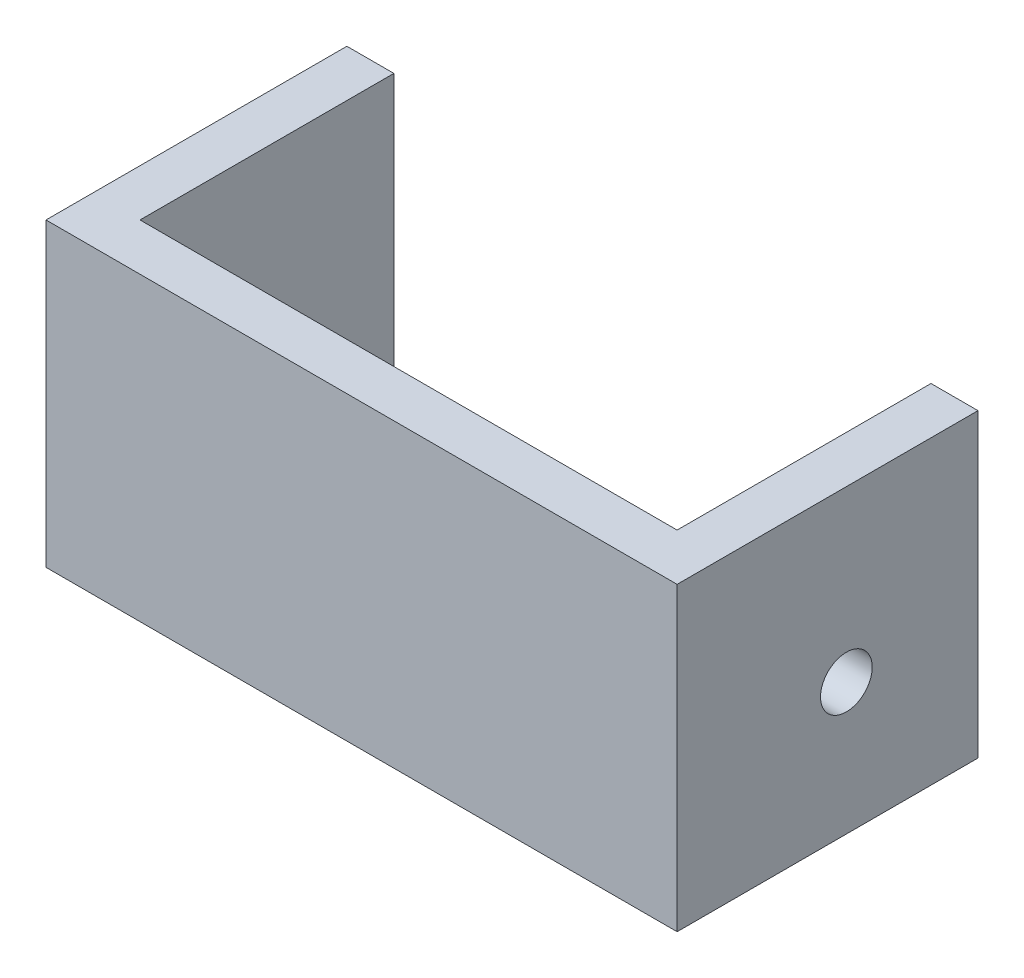
ISO-10303-21;
HEADER;
FILE_DESCRIPTION(('STEP AP214'),'2;1');
FILE_NAME('part.step','',(''),(''),'','','');
FILE_SCHEMA(('AUTOMOTIVE_DESIGN { 1 0 10303 214 1 1 1 1 }'));
ENDSEC;
DATA;
#1=APPLICATION_CONTEXT('core data for automotive mechanical design processes');
#2=APPLICATION_PROTOCOL_DEFINITION('international standard','automotive_design',2000,#1);
#3=PRODUCT_CONTEXT('',#1,'mechanical');
#4=PRODUCT('Part','Part','',(#3));
#5=PRODUCT_RELATED_PRODUCT_CATEGORY('part','',(#4));
#6=PRODUCT_DEFINITION_FORMATION('','',#4);
#7=PRODUCT_DEFINITION_CONTEXT('part definition',#1,'design');
#8=PRODUCT_DEFINITION('design','',#6,#7);
#9=PRODUCT_DEFINITION_SHAPE('','',#8);
#10=(LENGTH_UNIT() NAMED_UNIT(*) SI_UNIT(.MILLI.,.METRE.));
#11=(NAMED_UNIT(*) PLANE_ANGLE_UNIT() SI_UNIT($,.RADIAN.));
#12=(NAMED_UNIT(*) SI_UNIT($,.STERADIAN.) SOLID_ANGLE_UNIT());
#13=UNCERTAINTY_MEASURE_WITH_UNIT(LENGTH_MEASURE(1.E-05),#10,'distance_accuracy_value','');
#14=(GEOMETRIC_REPRESENTATION_CONTEXT(3) GLOBAL_UNCERTAINTY_ASSIGNED_CONTEXT((#13)) GLOBAL_UNIT_ASSIGNED_CONTEXT((#10,
#11,#12)) REPRESENTATION_CONTEXT('',''));
#15=CARTESIAN_POINT('',(0.,0.,0.));
#16=DIRECTION('',(0.,0.,1.));
#17=DIRECTION('',(1.,0.,0.));
#18=AXIS2_PLACEMENT_3D('',#15,#16,#17);
#19=CARTESIAN_POINT('',(-33.5625,16.,32.));
#20=DIRECTION('',(1.,0.,0.));
#21=DIRECTION('',(0.,0.,-1.));
#22=AXIS2_PLACEMENT_3D('',#19,#20,#21);
#23=PLANE('',#22);
#24=CARTESIAN_POINT('',(-33.5625,-2.,14.));
#25=DIRECTION('',(1.,0.,0.));
#26=DIRECTION('',(0.,0.,-1.));
#27=AXIS2_PLACEMENT_3D('',#24,#25,#26);
#28=CIRCLE('',#27,2.75);
#29=CARTESIAN_POINT('',(-33.5625,-2.,11.25));
#30=VERTEX_POINT('',#29);
#31=EDGE_CURVE('E230',#30,#30,#28,.T.);
#32=ORIENTED_EDGE('',*,*,#31,.T.);
#33=EDGE_LOOP('',(#32));
#34=FACE_BOUND('',#33,.T.);
#35=DIRECTION('',(0.,-1.,0.));
#36=VECTOR('',#35,1.);
#37=CARTESIAN_POINT('',(-33.5625,16.,0.));
#38=LINE('',#37,#36);
#39=CARTESIAN_POINT('',(-33.5625,16.,0.));
#40=VERTEX_POINT('',#39);
#41=CARTESIAN_POINT('',(-33.5625,-16.,0.));
#42=VERTEX_POINT('',#41);
#43=EDGE_CURVE('E161',#40,#42,#38,.T.);
#44=ORIENTED_EDGE('',*,*,#43,.T.);
#45=DIRECTION('',(0.,0.,-1.));
#46=VECTOR('',#45,1.);
#47=CARTESIAN_POINT('',(-33.5625,-16.,32.));
#48=LINE('',#47,#46);
#49=CARTESIAN_POINT('',(-33.5625,-16.,32.));
#50=VERTEX_POINT('',#49);
#51=EDGE_CURVE('E11',#50,#42,#48,.T.);
#52=ORIENTED_EDGE('',*,*,#51,.F.);
#53=DIRECTION('',(0.,-1.,0.));
#54=VECTOR('',#53,1.);
#55=CARTESIAN_POINT('',(-33.5625,16.,32.));
#56=LINE('',#55,#54);
#57=CARTESIAN_POINT('',(-33.5625,16.,32.));
#58=VERTEX_POINT('',#57);
#59=EDGE_CURVE('E167',#58,#50,#56,.T.);
#60=ORIENTED_EDGE('',*,*,#59,.F.);
#61=DIRECTION('',(0.,0.,-1.));
#62=VECTOR('',#61,1.);
#63=CARTESIAN_POINT('',(-33.5625,16.,32.));
#64=LINE('',#63,#62);
#65=EDGE_CURVE('E178',#58,#40,#64,.T.);
#66=ORIENTED_EDGE('',*,*,#65,.T.);
#67=EDGE_LOOP('',(#44,#52,#60,#66));
#68=FACE_BOUND('',#67,.T.);
#69=ADVANCED_FACE('F43',(#34,#68),#23,.F.);
#70=CARTESIAN_POINT('',(33.5625,-16.,32.));
#71=DIRECTION('',(0.,1.,0.));
#72=DIRECTION('',(0.,0.,1.));
#73=AXIS2_PLACEMENT_3D('',#70,#71,#72);
#74=PLANE('',#73);
#75=DIRECTION('',(1.,0.,0.));
#76=VECTOR('',#75,1.);
#77=CARTESIAN_POINT('',(33.5625,-16.,0.));
#78=LINE('',#77,#76);
#79=CARTESIAN_POINT('',(33.5625,-16.,0.));
#80=VERTEX_POINT('',#79);
#81=EDGE_CURVE('E182',#42,#80,#78,.T.);
#82=ORIENTED_EDGE('',*,*,#81,.T.);
#83=DIRECTION('',(0.,0.,-1.));
#84=VECTOR('',#83,1.);
#85=CARTESIAN_POINT('',(33.5625,-16.,32.));
#86=LINE('',#85,#84);
#87=CARTESIAN_POINT('',(33.5625,-16.,32.));
#88=VERTEX_POINT('',#87);
#89=EDGE_CURVE('E52',#88,#80,#86,.T.);
#90=ORIENTED_EDGE('',*,*,#89,.F.);
#91=DIRECTION('',(1.,0.,0.));
#92=VECTOR('',#91,1.);
#93=CARTESIAN_POINT('',(33.5625,-16.,32.));
#94=LINE('',#93,#92);
#95=EDGE_CURVE('E96',#50,#88,#94,.T.);
#96=ORIENTED_EDGE('',*,*,#95,.F.);
#97=ORIENTED_EDGE('',*,*,#51,.T.);
#98=EDGE_LOOP('',(#82,#90,#96,#97));
#99=FACE_BOUND('',#98,.T.);
#100=ADVANCED_FACE('F223',(#99),#74,.F.);
#101=CARTESIAN_POINT('',(33.5625,16.,32.));
#102=DIRECTION('',(-1.,0.,0.));
#103=DIRECTION('',(0.,0.,1.));
#104=AXIS2_PLACEMENT_3D('',#101,#102,#103);
#105=PLANE('',#104);
#106=CARTESIAN_POINT('',(33.5625,-2.,14.));
#107=DIRECTION('',(1.,0.,0.));
#108=DIRECTION('',(0.,0.,-1.));
#109=AXIS2_PLACEMENT_3D('',#106,#107,#108);
#110=CIRCLE('',#109,2.75);
#111=CARTESIAN_POINT('',(33.5625,-2.,11.25));
#112=VERTEX_POINT('',#111);
#113=EDGE_CURVE('E233',#112,#112,#110,.T.);
#114=ORIENTED_EDGE('',*,*,#113,.F.);
#115=EDGE_LOOP('',(#114));
#116=FACE_BOUND('',#115,.T.);
#117=DIRECTION('',(0.,1.,0.));
#118=VECTOR('',#117,1.);
#119=CARTESIAN_POINT('',(33.5625,16.,0.));
#120=LINE('',#119,#118);
#121=CARTESIAN_POINT('',(33.5625,16.,0.));
#122=VERTEX_POINT('',#121);
#123=EDGE_CURVE('E185',#80,#122,#120,.T.);
#124=ORIENTED_EDGE('',*,*,#123,.T.);
#125=DIRECTION('',(0.,0.,-1.));
#126=VECTOR('',#125,1.);
#127=CARTESIAN_POINT('',(33.5625,16.,32.));
#128=LINE('',#127,#126);
#129=CARTESIAN_POINT('',(33.5625,16.,32.));
#130=VERTEX_POINT('',#129);
#131=EDGE_CURVE('E193',#130,#122,#128,.T.);
#132=ORIENTED_EDGE('',*,*,#131,.F.);
#133=DIRECTION('',(0.,1.,0.));
#134=VECTOR('',#133,1.);
#135=CARTESIAN_POINT('',(33.5625,16.,32.));
#136=LINE('',#135,#134);
#137=EDGE_CURVE('E173',#88,#130,#136,.T.);
#138=ORIENTED_EDGE('',*,*,#137,.F.);
#139=ORIENTED_EDGE('',*,*,#89,.T.);
#140=EDGE_LOOP('',(#124,#132,#138,#139));
#141=FACE_BOUND('',#140,.T.);
#142=ADVANCED_FACE('F202',(#116,#141),#105,.F.);
#143=CARTESIAN_POINT('',(33.5625,16.,32.));
#144=DIRECTION('',(0.,-1.,0.));
#145=DIRECTION('',(0.,0.,-1.));
#146=AXIS2_PLACEMENT_3D('',#143,#144,#145);
#147=PLANE('',#146);
#148=DIRECTION('',(-1.,0.,0.));
#149=VECTOR('',#148,1.);
#150=CARTESIAN_POINT('',(33.5625,16.,0.));
#151=LINE('',#150,#149);
#152=CARTESIAN_POINT('',(28.5625,16.,0.));
#153=VERTEX_POINT('',#152);
#154=EDGE_CURVE('E170',#122,#153,#151,.T.);
#155=ORIENTED_EDGE('',*,*,#154,.T.);
#156=DIRECTION('',(0.,0.,-1.));
#157=VECTOR('',#156,1.);
#158=CARTESIAN_POINT('',(28.5625,16.,27.));
#159=LINE('',#158,#157);
#160=CARTESIAN_POINT('',(28.5625,16.,27.));
#161=VERTEX_POINT('',#160);
#162=EDGE_CURVE('E158',#161,#153,#159,.T.);
#163=ORIENTED_EDGE('',*,*,#162,.F.);
#164=DIRECTION('',(1.,0.,0.));
#165=VECTOR('',#164,1.);
#166=CARTESIAN_POINT('',(28.5625,16.,27.));
#167=LINE('',#166,#165);
#168=CARTESIAN_POINT('',(-28.5625,16.,27.));
#169=VERTEX_POINT('',#168);
#170=EDGE_CURVE('E126',#169,#161,#167,.T.);
#171=ORIENTED_EDGE('',*,*,#170,.F.);
#172=DIRECTION('',(0.,0.,-1.));
#173=VECTOR('',#172,1.);
#174=CARTESIAN_POINT('',(-28.5625,16.,27.));
#175=LINE('',#174,#173);
#176=CARTESIAN_POINT('',(-28.5625,16.,0.));
#177=VERTEX_POINT('',#176);
#178=EDGE_CURVE('E162',#169,#177,#175,.T.);
#179=ORIENTED_EDGE('',*,*,#178,.T.);
#180=EDGE_CURVE('E89',#177,#40,#151,.T.);
#181=ORIENTED_EDGE('',*,*,#180,.T.);
#182=ORIENTED_EDGE('',*,*,#65,.F.);
#183=DIRECTION('',(-1.,0.,0.));
#184=VECTOR('',#183,1.);
#185=CARTESIAN_POINT('',(33.5625,16.,32.));
#186=LINE('',#185,#184);
#187=EDGE_CURVE('E68',#130,#58,#186,.T.);
#188=ORIENTED_EDGE('',*,*,#187,.F.);
#189=ORIENTED_EDGE('',*,*,#131,.T.);
#190=EDGE_LOOP('',(#155,#163,#171,#179,#181,#182,#188,#189));
#191=FACE_BOUND('',#190,.T.);
#192=ADVANCED_FACE('F208',(#191),#147,.F.);
#193=CARTESIAN_POINT('',(0.,0.,32.));
#194=DIRECTION('',(0.,0.,-1.));
#195=DIRECTION('',(-1.,0.,0.));
#196=AXIS2_PLACEMENT_3D('',#193,#194,#195);
#197=PLANE('',#196);
#198=ORIENTED_EDGE('',*,*,#59,.T.);
#199=ORIENTED_EDGE('',*,*,#95,.T.);
#200=ORIENTED_EDGE('',*,*,#137,.T.);
#201=ORIENTED_EDGE('',*,*,#187,.T.);
#202=EDGE_LOOP('',(#198,#199,#200,#201));
#203=FACE_BOUND('',#202,.T.);
#204=ADVANCED_FACE('F212',(#203),#197,.F.);
#205=CARTESIAN_POINT('',(0.,0.,0.));
#206=DIRECTION('',(0.,0.,-1.));
#207=DIRECTION('',(-1.,0.,0.));
#208=AXIS2_PLACEMENT_3D('',#205,#206,#207);
#209=PLANE('',#208);
#210=DIRECTION('',(0.,-1.,0.));
#211=VECTOR('',#210,1.);
#212=CARTESIAN_POINT('',(28.5625,16.,0.));
#213=LINE('',#212,#211);
#214=CARTESIAN_POINT('',(28.5625,-11.,0.));
#215=VERTEX_POINT('',#214);
#216=EDGE_CURVE('E59',#153,#215,#213,.T.);
#217=ORIENTED_EDGE('',*,*,#216,.F.);
#218=ORIENTED_EDGE('',*,*,#154,.F.);
#219=ORIENTED_EDGE('',*,*,#123,.F.);
#220=ORIENTED_EDGE('',*,*,#81,.F.);
#221=ORIENTED_EDGE('',*,*,#43,.F.);
#222=ORIENTED_EDGE('',*,*,#180,.F.);
#223=DIRECTION('',(0.,1.,0.));
#224=VECTOR('',#223,1.);
#225=CARTESIAN_POINT('',(-28.5625,16.,0.));
#226=LINE('',#225,#224);
#227=CARTESIAN_POINT('',(-28.5625,-11.,0.));
#228=VERTEX_POINT('',#227);
#229=EDGE_CURVE('E141',#228,#177,#226,.T.);
#230=ORIENTED_EDGE('',*,*,#229,.F.);
#231=DIRECTION('',(-1.,0.,0.));
#232=VECTOR('',#231,1.);
#233=CARTESIAN_POINT('',(28.5625,-11.,0.));
#234=LINE('',#233,#232);
#235=EDGE_CURVE('E144',#215,#228,#234,.T.);
#236=ORIENTED_EDGE('',*,*,#235,.F.);
#237=EDGE_LOOP('',(#217,#218,#219,#220,#221,#222,#230,#236));
#238=FACE_BOUND('',#237,.T.);
#239=ADVANCED_FACE('F206',(#238),#209,.T.);
#240=CARTESIAN_POINT('',(28.5625,16.,27.));
#241=DIRECTION('',(1.,0.,0.));
#242=DIRECTION('',(0.,1.,0.));
#243=AXIS2_PLACEMENT_3D('',#240,#241,#242);
#244=PLANE('',#243);
#245=CARTESIAN_POINT('',(28.5625,-2.,14.));
#246=DIRECTION('',(1.,0.,0.));
#247=DIRECTION('',(0.,1.,0.));
#248=AXIS2_PLACEMENT_3D('',#245,#246,#247);
#249=CIRCLE('',#248,2.75);
#250=CARTESIAN_POINT('',(28.5625,0.749999999999998,14.));
#251=VERTEX_POINT('',#250);
#252=EDGE_CURVE('E147',#251,#251,#249,.T.);
#253=ORIENTED_EDGE('',*,*,#252,.T.);
#254=EDGE_LOOP('',(#253));
#255=FACE_BOUND('',#254,.T.);
#256=ORIENTED_EDGE('',*,*,#216,.T.);
#257=DIRECTION('',(0.,0.,-1.));
#258=VECTOR('',#257,1.);
#259=CARTESIAN_POINT('',(28.5625,-11.,27.));
#260=LINE('',#259,#258);
#261=CARTESIAN_POINT('',(28.5625,-11.,27.));
#262=VERTEX_POINT('',#261);
#263=EDGE_CURVE('E115',#262,#215,#260,.T.);
#264=ORIENTED_EDGE('',*,*,#263,.F.);
#265=DIRECTION('',(0.,-1.,0.));
#266=VECTOR('',#265,1.);
#267=CARTESIAN_POINT('',(28.5625,16.,27.));
#268=LINE('',#267,#266);
#269=EDGE_CURVE('E119',#161,#262,#268,.T.);
#270=ORIENTED_EDGE('',*,*,#269,.F.);
#271=ORIENTED_EDGE('',*,*,#162,.T.);
#272=EDGE_LOOP('',(#256,#264,#270,#271));
#273=FACE_BOUND('',#272,.T.);
#274=ADVANCED_FACE('F117',(#255,#273),#244,.F.);
#275=CARTESIAN_POINT('',(-28.5625,16.,27.));
#276=DIRECTION('',(-1.,0.,0.));
#277=DIRECTION('',(0.,-1.,0.));
#278=AXIS2_PLACEMENT_3D('',#275,#276,#277);
#279=PLANE('',#278);
#280=CARTESIAN_POINT('',(-28.5625,-2.,14.));
#281=DIRECTION('',(-1.,0.,0.));
#282=DIRECTION('',(0.,-1.,0.));
#283=AXIS2_PLACEMENT_3D('',#280,#281,#282);
#284=CIRCLE('',#283,2.75);
#285=CARTESIAN_POINT('',(-28.5625,-4.75,14.));
#286=VERTEX_POINT('',#285);
#287=EDGE_CURVE('E46',#286,#286,#284,.T.);
#288=ORIENTED_EDGE('',*,*,#287,.T.);
#289=EDGE_LOOP('',(#288));
#290=FACE_BOUND('',#289,.T.);
#291=ORIENTED_EDGE('',*,*,#229,.T.);
#292=ORIENTED_EDGE('',*,*,#178,.F.);
#293=DIRECTION('',(0.,1.,0.));
#294=VECTOR('',#293,1.);
#295=CARTESIAN_POINT('',(-28.5625,16.,27.));
#296=LINE('',#295,#294);
#297=CARTESIAN_POINT('',(-28.5625,-11.,27.));
#298=VERTEX_POINT('',#297);
#299=EDGE_CURVE('E135',#298,#169,#296,.T.);
#300=ORIENTED_EDGE('',*,*,#299,.F.);
#301=DIRECTION('',(0.,0.,-1.));
#302=VECTOR('',#301,1.);
#303=CARTESIAN_POINT('',(-28.5625,-11.,27.));
#304=LINE('',#303,#302);
#305=EDGE_CURVE('E125',#298,#228,#304,.T.);
#306=ORIENTED_EDGE('',*,*,#305,.T.);
#307=EDGE_LOOP('',(#291,#292,#300,#306));
#308=FACE_BOUND('',#307,.T.);
#309=ADVANCED_FACE('F276',(#290,#308),#279,.F.);
#310=CARTESIAN_POINT('',(28.5625,-11.,27.));
#311=DIRECTION('',(0.,-1.,0.));
#312=DIRECTION('',(0.,0.,-1.));
#313=AXIS2_PLACEMENT_3D('',#310,#311,#312);
#314=PLANE('',#313);
#315=ORIENTED_EDGE('',*,*,#235,.T.);
#316=ORIENTED_EDGE('',*,*,#305,.F.);
#317=DIRECTION('',(-1.,0.,0.));
#318=VECTOR('',#317,1.);
#319=CARTESIAN_POINT('',(28.5625,-11.,27.));
#320=LINE('',#319,#318);
#321=EDGE_CURVE('E129',#262,#298,#320,.T.);
#322=ORIENTED_EDGE('',*,*,#321,.F.);
#323=ORIENTED_EDGE('',*,*,#263,.T.);
#324=EDGE_LOOP('',(#315,#316,#322,#323));
#325=FACE_BOUND('',#324,.T.);
#326=ADVANCED_FACE('F130',(#325),#314,.F.);
#327=CARTESIAN_POINT('',(0.,0.,27.));
#328=DIRECTION('',(0.,0.,-1.));
#329=DIRECTION('',(-1.,0.,0.));
#330=AXIS2_PLACEMENT_3D('',#327,#328,#329);
#331=PLANE('',#330);
#332=ORIENTED_EDGE('',*,*,#269,.T.);
#333=ORIENTED_EDGE('',*,*,#321,.T.);
#334=ORIENTED_EDGE('',*,*,#299,.T.);
#335=ORIENTED_EDGE('',*,*,#170,.T.);
#336=EDGE_LOOP('',(#332,#333,#334,#335));
#337=FACE_BOUND('',#336,.T.);
#338=ADVANCED_FACE('F137',(#337),#331,.T.);
#339=CARTESIAN_POINT('',(-33.5625,-2.,14.));
#340=DIRECTION('',(1.,0.,0.));
#341=DIRECTION('',(0.,0.,-1.));
#342=AXIS2_PLACEMENT_3D('',#339,#340,#341);
#343=CYLINDRICAL_SURFACE('',#342,2.75);
#344=ORIENTED_EDGE('',*,*,#31,.F.);
#345=EDGE_LOOP('',(#344));
#346=FACE_BOUND('',#345,.T.);
#347=ORIENTED_EDGE('',*,*,#287,.F.);
#348=EDGE_LOOP('',(#347));
#349=FACE_BOUND('',#348,.T.);
#350=ADVANCED_FACE('F287',(#346,#349),#343,.F.);
#351=ORIENTED_EDGE('',*,*,#113,.T.);
#352=EDGE_LOOP('',(#351));
#353=FACE_BOUND('',#352,.T.);
#354=ORIENTED_EDGE('',*,*,#252,.F.);
#355=EDGE_LOOP('',(#354));
#356=FACE_BOUND('',#355,.T.);
#357=ADVANCED_FACE('F241',(#353,#356),#343,.F.);
#358=CLOSED_SHELL('',(#69,#100,#142,#192,#204,#239,#274,#309,#326,#338,#350,#357));
#359=MANIFOLD_SOLID_BREP('B2',#358);
#360=ADVANCED_BREP_SHAPE_REPRESENTATION('',(#18,#359),#14);
#361=SHAPE_DEFINITION_REPRESENTATION(#9,#360);
ENDSEC;
END-ISO-10303-21;
